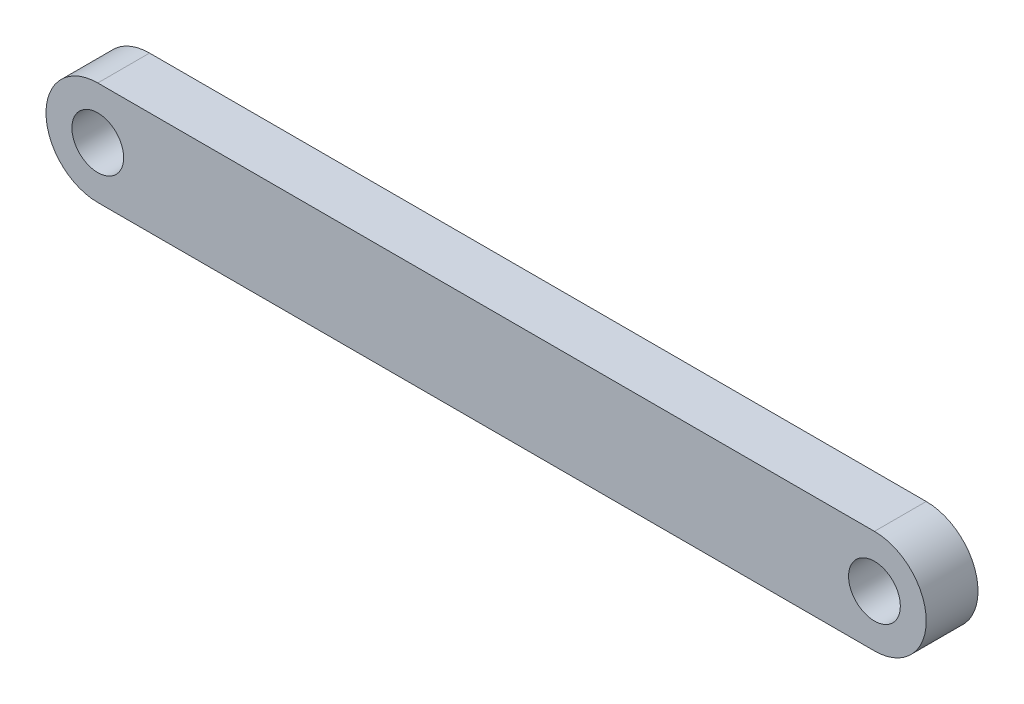
ISO-10303-21;
HEADER;
FILE_DESCRIPTION(('STEP AP214'),'2;1');
FILE_NAME('part.step','',(''),(''),'','','');
FILE_SCHEMA(('AUTOMOTIVE_DESIGN { 1 0 10303 214 1 1 1 1 }'));
ENDSEC;
DATA;
#1=APPLICATION_CONTEXT('core data for automotive mechanical design processes');
#2=APPLICATION_PROTOCOL_DEFINITION('international standard','automotive_design',2000,#1);
#3=PRODUCT_CONTEXT('',#1,'mechanical');
#4=PRODUCT('Part','Part','',(#3));
#5=PRODUCT_RELATED_PRODUCT_CATEGORY('part','',(#4));
#6=PRODUCT_DEFINITION_FORMATION('','',#4);
#7=PRODUCT_DEFINITION_CONTEXT('part definition',#1,'design');
#8=PRODUCT_DEFINITION('design','',#6,#7);
#9=PRODUCT_DEFINITION_SHAPE('','',#8);
#10=(LENGTH_UNIT() NAMED_UNIT(*) SI_UNIT(.MILLI.,.METRE.));
#11=(NAMED_UNIT(*) PLANE_ANGLE_UNIT() SI_UNIT($,.RADIAN.));
#12=(NAMED_UNIT(*) SI_UNIT($,.STERADIAN.) SOLID_ANGLE_UNIT());
#13=UNCERTAINTY_MEASURE_WITH_UNIT(LENGTH_MEASURE(1.E-05),#10,'distance_accuracy_value','');
#14=(GEOMETRIC_REPRESENTATION_CONTEXT(3) GLOBAL_UNCERTAINTY_ASSIGNED_CONTEXT((#13)) GLOBAL_UNIT_ASSIGNED_CONTEXT((#10,
#11,#12)) REPRESENTATION_CONTEXT('',''));
#15=CARTESIAN_POINT('',(0.,0.,0.));
#16=DIRECTION('',(0.,0.,1.));
#17=DIRECTION('',(1.,0.,0.));
#18=AXIS2_PLACEMENT_3D('',#15,#16,#17);
#19=CARTESIAN_POINT('',(0.,0.,10.));
#20=DIRECTION('',(0.,0.,1.));
#21=DIRECTION('',(1.,0.,0.));
#22=AXIS2_PLACEMENT_3D('',#19,#20,#21);
#23=PLANE('',#22);
#24=CARTESIAN_POINT('',(0.,0.,10.));
#25=DIRECTION('',(0.,0.,1.));
#26=DIRECTION('',(1.,0.,0.));
#27=AXIS2_PLACEMENT_3D('',#24,#25,#26);
#28=CIRCLE('',#27,5.);
#29=CARTESIAN_POINT('',(5.,0.,10.));
#30=VERTEX_POINT('',#29);
#31=EDGE_CURVE('E112',#30,#30,#28,.T.);
#32=ORIENTED_EDGE('',*,*,#31,.F.);
#33=EDGE_LOOP('',(#32));
#34=FACE_BOUND('',#33,.T.);
#35=CARTESIAN_POINT('',(0.,0.,10.));
#36=DIRECTION('',(0.,0.,1.));
#37=DIRECTION('',(1.,0.,0.));
#38=AXIS2_PLACEMENT_3D('',#35,#36,#37);
#39=CIRCLE('',#38,10.);
#40=CARTESIAN_POINT('',(0.,10.,10.));
#41=VERTEX_POINT('',#40);
#42=CARTESIAN_POINT('',(0.,-10.,10.));
#43=VERTEX_POINT('',#42);
#44=EDGE_CURVE('E92',#41,#43,#39,.T.);
#45=ORIENTED_EDGE('',*,*,#44,.T.);
#46=DIRECTION('',(1.,0.,0.));
#47=VECTOR('',#46,1.);
#48=CARTESIAN_POINT('',(0.,-10.,10.));
#49=LINE('',#48,#47);
#50=CARTESIAN_POINT('',(150.,-10.,10.));
#51=VERTEX_POINT('',#50);
#52=EDGE_CURVE('E87',#43,#51,#49,.T.);
#53=ORIENTED_EDGE('',*,*,#52,.T.);
#54=CARTESIAN_POINT('',(150.,0.,10.));
#55=DIRECTION('',(0.,0.,1.));
#56=DIRECTION('',(1.,0.,0.));
#57=AXIS2_PLACEMENT_3D('',#54,#55,#56);
#58=CIRCLE('',#57,10.);
#59=CARTESIAN_POINT('',(150.,10.,10.));
#60=VERTEX_POINT('',#59);
#61=EDGE_CURVE('E90',#51,#60,#58,.T.);
#62=ORIENTED_EDGE('',*,*,#61,.T.);
#63=DIRECTION('',(-1.,0.,0.));
#64=VECTOR('',#63,1.);
#65=CARTESIAN_POINT('',(0.,10.,10.));
#66=LINE('',#65,#64);
#67=EDGE_CURVE('E57',#60,#41,#66,.T.);
#68=ORIENTED_EDGE('',*,*,#67,.T.);
#69=EDGE_LOOP('',(#45,#53,#62,#68));
#70=FACE_BOUND('',#69,.T.);
#71=CARTESIAN_POINT('',(150.,0.,10.));
#72=DIRECTION('',(0.,0.,1.));
#73=DIRECTION('',(1.,0.,0.));
#74=AXIS2_PLACEMENT_3D('',#71,#72,#73);
#75=CIRCLE('',#74,5.00000000000002);
#76=CARTESIAN_POINT('',(155.,0.,10.));
#77=VERTEX_POINT('',#76);
#78=EDGE_CURVE('E134',#77,#77,#75,.T.);
#79=ORIENTED_EDGE('',*,*,#78,.F.);
#80=EDGE_LOOP('',(#79));
#81=FACE_BOUND('',#80,.T.);
#82=ADVANCED_FACE('F39',(#34,#70,#81),#23,.T.);
#83=CARTESIAN_POINT('',(0.,0.,0.));
#84=DIRECTION('',(0.,0.,1.));
#85=DIRECTION('',(1.,0.,0.));
#86=AXIS2_PLACEMENT_3D('',#83,#84,#85);
#87=PLANE('',#86);
#88=CARTESIAN_POINT('',(0.,0.,0.));
#89=DIRECTION('',(0.,0.,1.));
#90=DIRECTION('',(1.,0.,0.));
#91=AXIS2_PLACEMENT_3D('',#88,#89,#90);
#92=CIRCLE('',#91,10.);
#93=CARTESIAN_POINT('',(0.,10.,0.));
#94=VERTEX_POINT('',#93);
#95=CARTESIAN_POINT('',(0.,-10.,0.));
#96=VERTEX_POINT('',#95);
#97=EDGE_CURVE('E108',#94,#96,#92,.T.);
#98=ORIENTED_EDGE('',*,*,#97,.F.);
#99=DIRECTION('',(-1.,0.,0.));
#100=VECTOR('',#99,1.);
#101=CARTESIAN_POINT('',(0.,10.,0.));
#102=LINE('',#101,#100);
#103=CARTESIAN_POINT('',(150.,10.,0.));
#104=VERTEX_POINT('',#103);
#105=EDGE_CURVE('E80',#104,#94,#102,.T.);
#106=ORIENTED_EDGE('',*,*,#105,.F.);
#107=CARTESIAN_POINT('',(150.,0.,0.));
#108=DIRECTION('',(0.,0.,1.));
#109=DIRECTION('',(1.,0.,0.));
#110=AXIS2_PLACEMENT_3D('',#107,#108,#109);
#111=CIRCLE('',#110,10.);
#112=CARTESIAN_POINT('',(150.,-10.,0.));
#113=VERTEX_POINT('',#112);
#114=EDGE_CURVE('E74',#113,#104,#111,.T.);
#115=ORIENTED_EDGE('',*,*,#114,.F.);
#116=DIRECTION('',(1.,0.,0.));
#117=VECTOR('',#116,1.);
#118=CARTESIAN_POINT('',(0.,-10.,0.));
#119=LINE('',#118,#117);
#120=EDGE_CURVE('E97',#96,#113,#119,.T.);
#121=ORIENTED_EDGE('',*,*,#120,.F.);
#122=EDGE_LOOP('',(#98,#106,#115,#121));
#123=FACE_BOUND('',#122,.T.);
#124=CARTESIAN_POINT('',(0.,0.,0.));
#125=DIRECTION('',(0.,0.,1.));
#126=DIRECTION('',(1.,0.,0.));
#127=AXIS2_PLACEMENT_3D('',#124,#125,#126);
#128=CIRCLE('',#127,5.);
#129=CARTESIAN_POINT('',(5.,0.,0.));
#130=VERTEX_POINT('',#129);
#131=EDGE_CURVE('E130',#130,#130,#128,.T.);
#132=ORIENTED_EDGE('',*,*,#131,.T.);
#133=EDGE_LOOP('',(#132));
#134=FACE_BOUND('',#133,.T.);
#135=CARTESIAN_POINT('',(150.,0.,0.));
#136=DIRECTION('',(0.,0.,1.));
#137=DIRECTION('',(1.,0.,0.));
#138=AXIS2_PLACEMENT_3D('',#135,#136,#137);
#139=CIRCLE('',#138,5.00000000000002);
#140=CARTESIAN_POINT('',(155.,0.,0.));
#141=VERTEX_POINT('',#140);
#142=EDGE_CURVE('E138',#141,#141,#139,.T.);
#143=ORIENTED_EDGE('',*,*,#142,.T.);
#144=EDGE_LOOP('',(#143));
#145=FACE_BOUND('',#144,.T.);
#146=ADVANCED_FACE('F125',(#123,#134,#145),#87,.F.);
#147=CARTESIAN_POINT('',(0.,0.,10.));
#148=DIRECTION('',(0.,0.,-1.));
#149=DIRECTION('',(-1.,0.,0.));
#150=AXIS2_PLACEMENT_3D('',#147,#148,#149);
#151=CYLINDRICAL_SURFACE('',#150,10.);
#152=ORIENTED_EDGE('',*,*,#97,.T.);
#153=DIRECTION('',(0.,0.,-1.));
#154=VECTOR('',#153,1.);
#155=CARTESIAN_POINT('',(0.,-10.,10.));
#156=LINE('',#155,#154);
#157=EDGE_CURVE('E11',#43,#96,#156,.T.);
#158=ORIENTED_EDGE('',*,*,#157,.F.);
#159=ORIENTED_EDGE('',*,*,#44,.F.);
#160=DIRECTION('',(0.,0.,-1.));
#161=VECTOR('',#160,1.);
#162=CARTESIAN_POINT('',(0.,10.,10.));
#163=LINE('',#162,#161);
#164=EDGE_CURVE('E104',#41,#94,#163,.T.);
#165=ORIENTED_EDGE('',*,*,#164,.T.);
#166=EDGE_LOOP('',(#152,#158,#159,#165));
#167=FACE_BOUND('',#166,.T.);
#168=ADVANCED_FACE('F41',(#167),#151,.T.);
#169=CARTESIAN_POINT('',(0.,-10.,10.));
#170=DIRECTION('',(0.,1.,0.));
#171=DIRECTION('',(0.,0.,1.));
#172=AXIS2_PLACEMENT_3D('',#169,#170,#171);
#173=PLANE('',#172);
#174=ORIENTED_EDGE('',*,*,#120,.T.);
#175=DIRECTION('',(0.,0.,-1.));
#176=VECTOR('',#175,1.);
#177=CARTESIAN_POINT('',(150.,-10.,10.));
#178=LINE('',#177,#176);
#179=EDGE_CURVE('E49',#51,#113,#178,.T.);
#180=ORIENTED_EDGE('',*,*,#179,.F.);
#181=ORIENTED_EDGE('',*,*,#52,.F.);
#182=ORIENTED_EDGE('',*,*,#157,.T.);
#183=EDGE_LOOP('',(#174,#180,#181,#182));
#184=FACE_BOUND('',#183,.T.);
#185=ADVANCED_FACE('F96',(#184),#173,.F.);
#186=CARTESIAN_POINT('',(150.,0.,10.));
#187=DIRECTION('',(0.,0.,-1.));
#188=DIRECTION('',(-1.,0.,0.));
#189=AXIS2_PLACEMENT_3D('',#186,#187,#188);
#190=CYLINDRICAL_SURFACE('',#189,10.);
#191=ORIENTED_EDGE('',*,*,#114,.T.);
#192=DIRECTION('',(0.,0.,-1.));
#193=VECTOR('',#192,1.);
#194=CARTESIAN_POINT('',(150.,10.,10.));
#195=LINE('',#194,#193);
#196=EDGE_CURVE('E99',#60,#104,#195,.T.);
#197=ORIENTED_EDGE('',*,*,#196,.F.);
#198=ORIENTED_EDGE('',*,*,#61,.F.);
#199=ORIENTED_EDGE('',*,*,#179,.T.);
#200=EDGE_LOOP('',(#191,#197,#198,#199));
#201=FACE_BOUND('',#200,.T.);
#202=ADVANCED_FACE('F100',(#201),#190,.T.);
#203=CARTESIAN_POINT('',(0.,10.,10.));
#204=DIRECTION('',(0.,-1.,0.));
#205=DIRECTION('',(0.,0.,-1.));
#206=AXIS2_PLACEMENT_3D('',#203,#204,#205);
#207=PLANE('',#206);
#208=ORIENTED_EDGE('',*,*,#105,.T.);
#209=ORIENTED_EDGE('',*,*,#164,.F.);
#210=ORIENTED_EDGE('',*,*,#67,.F.);
#211=ORIENTED_EDGE('',*,*,#196,.T.);
#212=EDGE_LOOP('',(#208,#209,#210,#211));
#213=FACE_BOUND('',#212,.T.);
#214=ADVANCED_FACE('F122',(#213),#207,.F.);
#215=CARTESIAN_POINT('',(0.,0.,10.));
#216=DIRECTION('',(0.,0.,-1.));
#217=DIRECTION('',(-1.,0.,0.));
#218=AXIS2_PLACEMENT_3D('',#215,#216,#217);
#219=CYLINDRICAL_SURFACE('',#218,5.);
#220=ORIENTED_EDGE('',*,*,#31,.T.);
#221=EDGE_LOOP('',(#220));
#222=FACE_BOUND('',#221,.T.);
#223=ORIENTED_EDGE('',*,*,#131,.F.);
#224=EDGE_LOOP('',(#223));
#225=FACE_BOUND('',#224,.T.);
#226=ADVANCED_FACE('F157',(#222,#225),#219,.F.);
#227=CARTESIAN_POINT('',(150.,0.,10.));
#228=DIRECTION('',(0.,0.,-1.));
#229=DIRECTION('',(-1.,0.,0.));
#230=AXIS2_PLACEMENT_3D('',#227,#228,#229);
#231=CYLINDRICAL_SURFACE('',#230,5.00000000000002);
#232=ORIENTED_EDGE('',*,*,#78,.T.);
#233=EDGE_LOOP('',(#232));
#234=FACE_BOUND('',#233,.T.);
#235=ORIENTED_EDGE('',*,*,#142,.F.);
#236=EDGE_LOOP('',(#235));
#237=FACE_BOUND('',#236,.T.);
#238=ADVANCED_FACE('F146',(#234,#237),#231,.F.);
#239=CLOSED_SHELL('',(#82,#146,#168,#185,#202,#214,#226,#238));
#240=MANIFOLD_SOLID_BREP('B2',#239);
#241=ADVANCED_BREP_SHAPE_REPRESENTATION('',(#18,#240),#14);
#242=SHAPE_DEFINITION_REPRESENTATION(#9,#241);
ENDSEC;
END-ISO-10303-21;
